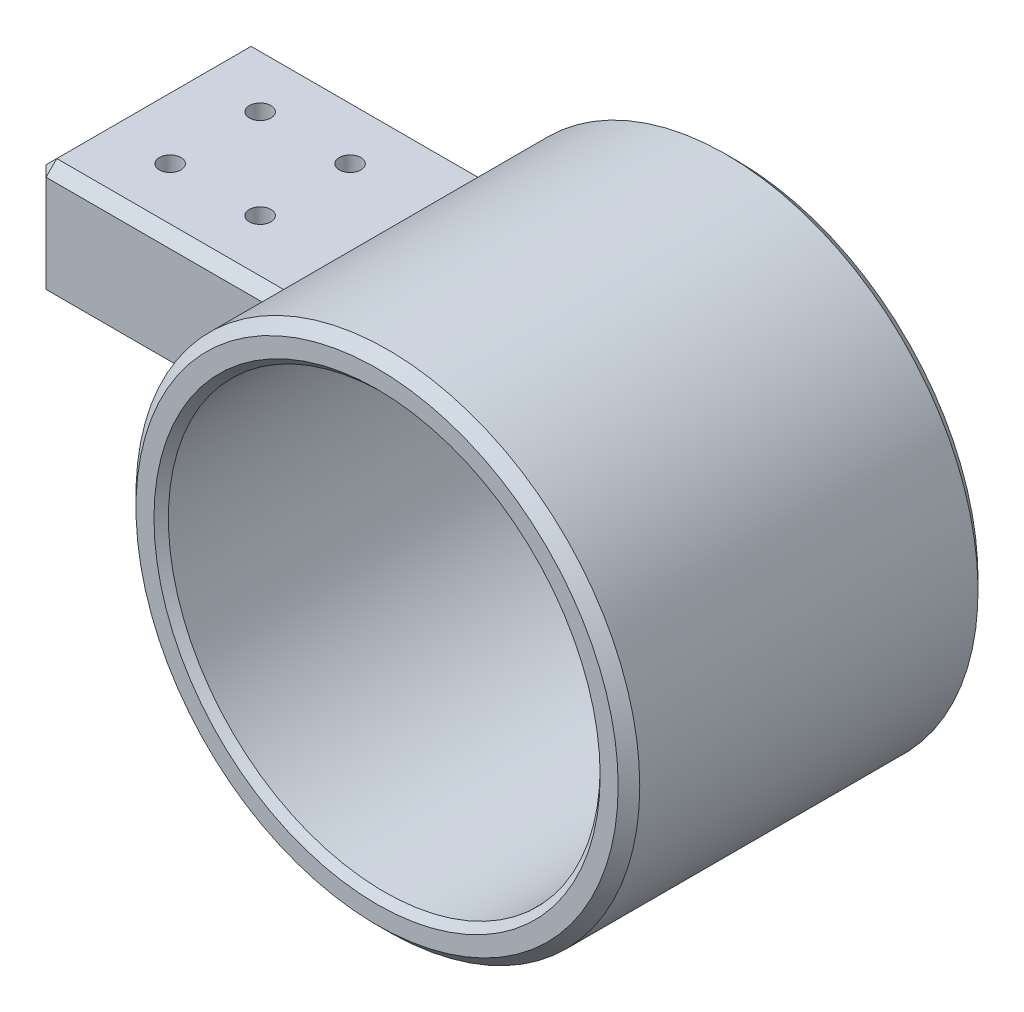
ISO-10303-21;
HEADER;
FILE_DESCRIPTION(('STEP AP214'),'2;1');
FILE_NAME('part.step','',(''),(''),'','','');
FILE_SCHEMA(('AUTOMOTIVE_DESIGN { 1 0 10303 214 1 1 1 1 }'));
ENDSEC;
DATA;
#1=APPLICATION_CONTEXT('core data for automotive mechanical design processes');
#2=APPLICATION_PROTOCOL_DEFINITION('international standard','automotive_design',2000,#1);
#3=PRODUCT_CONTEXT('',#1,'mechanical');
#4=PRODUCT('Part','Part','',(#3));
#5=PRODUCT_RELATED_PRODUCT_CATEGORY('part','',(#4));
#6=PRODUCT_DEFINITION_FORMATION('','',#4);
#7=PRODUCT_DEFINITION_CONTEXT('part definition',#1,'design');
#8=PRODUCT_DEFINITION('design','',#6,#7);
#9=PRODUCT_DEFINITION_SHAPE('','',#8);
#10=(LENGTH_UNIT() NAMED_UNIT(*) SI_UNIT(.MILLI.,.METRE.));
#11=(NAMED_UNIT(*) PLANE_ANGLE_UNIT() SI_UNIT($,.RADIAN.));
#12=(NAMED_UNIT(*) SI_UNIT($,.STERADIAN.) SOLID_ANGLE_UNIT());
#13=UNCERTAINTY_MEASURE_WITH_UNIT(LENGTH_MEASURE(1.E-05),#10,'distance_accuracy_value','');
#14=(GEOMETRIC_REPRESENTATION_CONTEXT(3) GLOBAL_UNCERTAINTY_ASSIGNED_CONTEXT((#13)) GLOBAL_UNIT_ASSIGNED_CONTEXT((#10,
#11,#12)) REPRESENTATION_CONTEXT('',''));
#15=CARTESIAN_POINT('',(0.,0.,0.));
#16=DIRECTION('',(0.,0.,1.));
#17=DIRECTION('',(1.,0.,0.));
#18=AXIS2_PLACEMENT_3D('',#15,#16,#17);
#19=CARTESIAN_POINT('',(0.,0.,50.));
#20=DIRECTION('',(0.,0.,-1.));
#21=DIRECTION('',(-1.,0.,0.));
#22=AXIS2_PLACEMENT_3D('',#19,#20,#21);
#23=CYLINDRICAL_SURFACE('',#22,35.);
#24=CARTESIAN_POINT('',(0.,0.,48.5));
#25=DIRECTION('',(0.,0.,1.));
#26=DIRECTION('',(1.,0.,0.));
#27=AXIS2_PLACEMENT_3D('',#24,#25,#26);
#28=CIRCLE('',#27,35.);
#29=CARTESIAN_POINT('',(35.,0.,48.5));
#30=VERTEX_POINT('',#29);
#31=EDGE_CURVE('E184',#30,#30,#28,.F.);
#32=ORIENTED_EDGE('',*,*,#31,.T.);
#33=EDGE_LOOP('',(#32));
#34=FACE_BOUND('',#33,.T.);
#35=DIRECTION('',(0.,0.,-1.));
#36=VECTOR('',#35,1.);
#37=CARTESIAN_POINT('',(-31.2196559377255,15.8219178082192,50.));
#38=LINE('',#37,#36);
#39=CARTESIAN_POINT('',(-31.2196559377255,15.8219178082192,1.5));
#40=VERTEX_POINT('',#39);
#41=CARTESIAN_POINT('',(-31.2196559377255,15.8219178082192,28.5));
#42=VERTEX_POINT('',#41);
#43=EDGE_CURVE('E181',#40,#42,#38,.F.);
#44=ORIENTED_EDGE('',*,*,#43,.T.);
#45=CARTESIAN_POINT('',(-32.518020467039,12.945205479452,31.5));
#46=CARTESIAN_POINT('',(-32.4705173129702,13.0645316276012,31.3720006531807));
#47=CARTESIAN_POINT('',(-32.4222557667148,13.1838528155139,31.2442801791965));
#48=CARTESIAN_POINT('',(-32.3241816362658,13.4225156631757,30.9894507002295));
#49=CARTESIAN_POINT('',(-32.2743690235219,13.5418573232613,30.8623417065519));
#50=CARTESIAN_POINT('',(-32.1225517348467,13.8999617613975,30.4820092355911));
#51=CARTESIAN_POINT('',(-32.0181714839425,14.1387942531903,30.2297907348745));
#52=CARTESIAN_POINT('',(-31.8564808952528,14.4976502028595,29.8538718835793));
#53=CARTESIAN_POINT('',(-31.8016887549302,14.6174578121394,29.7288766405428));
#54=CARTESIAN_POINT('',(-31.6903462810003,14.8573023564548,29.4799014768715));
#55=CARTESIAN_POINT('',(-31.633796013649,14.9773392826887,29.3559215181972));
#56=CARTESIAN_POINT('',(-31.5188139382657,15.2178235133599,29.1090813902841));
#57=CARTESIAN_POINT('',(-31.4603810609639,15.3382710149878,28.9862219101428));
#58=CARTESIAN_POINT('',(-31.3415348071999,15.5796746361056,28.7419541355256));
#59=CARTESIAN_POINT('',(-31.2811213134111,15.700630785355,28.6205459276027));
#60=CARTESIAN_POINT('',(-31.2196559377255,15.8219178082192,28.5));
#61=B_SPLINE_CURVE_WITH_KNOTS('',3,(#45,#46,#47,#48,#49,#50,#51,#52,#53,#54,#55,#56,#57,#58,#59,
#60),.UNSPECIFIED.,.F.,.F.,(4,2,2,2,2,2,2,4),(0.,0.543972994265221,1.08795600733076,
2.1759664751342,2.72076838902824,3.26554979657465,3.81064627730311,4.35577510666938),.UNSPECIFIED.);
#62=CARTESIAN_POINT('',(-32.518020467039,12.945205479452,31.5));
#63=VERTEX_POINT('',#62);
#64=EDGE_CURVE('E49',#42,#63,#61,.F.);
#65=ORIENTED_EDGE('',*,*,#64,.T.);
#66=CARTESIAN_POINT('',(0.,0.,31.5));
#67=DIRECTION('',(0.,0.,1.));
#68=DIRECTION('',(1.,0.,0.));
#69=AXIS2_PLACEMENT_3D('',#66,#67,#68);
#70=CIRCLE('',#69,35.);
#71=CARTESIAN_POINT('',(-34.9704322470338,-1.43835616438356,31.5));
#72=VERTEX_POINT('',#71);
#73=EDGE_CURVE('E140',#63,#72,#70,.T.);
#74=ORIENTED_EDGE('',*,*,#73,.T.);
#75=DIRECTION('',(0.,0.,-1.));
#76=VECTOR('',#75,1.);
#77=CARTESIAN_POINT('',(-34.9704322470338,-1.43835616438355,50.));
#78=LINE('',#77,#76);
#79=CARTESIAN_POINT('',(-34.9704322470338,-1.43835616438356,1.5));
#80=VERTEX_POINT('',#79);
#81=EDGE_CURVE('E133',#72,#80,#78,.T.);
#82=ORIENTED_EDGE('',*,*,#81,.T.);
#83=CARTESIAN_POINT('',(0.,0.,1.5));
#84=DIRECTION('',(0.,0.,1.));
#85=DIRECTION('',(1.,0.,0.));
#86=AXIS2_PLACEMENT_3D('',#83,#84,#85);
#87=CIRCLE('',#86,35.);
#88=EDGE_CURVE('E137',#80,#40,#87,.T.);
#89=ORIENTED_EDGE('',*,*,#88,.T.);
#90=EDGE_LOOP('',(#44,#65,#74,#82,#89));
#91=FACE_BOUND('',#90,.T.);
#92=ADVANCED_FACE('F39',(#34,#91),#23,.T.);
#93=CARTESIAN_POINT('',(0.,0.,50.));
#94=DIRECTION('',(0.,0.,1.));
#95=DIRECTION('',(1.,0.,0.));
#96=AXIS2_PLACEMENT_3D('',#93,#94,#95);
#97=PLANE('',#96);
#98=CARTESIAN_POINT('',(0.,0.,50.));
#99=DIRECTION('',(0.,0.,1.));
#100=DIRECTION('',(1.,0.,0.));
#101=AXIS2_PLACEMENT_3D('',#98,#99,#100);
#102=CIRCLE('',#101,33.5);
#103=CARTESIAN_POINT('',(33.5,0.,50.));
#104=VERTEX_POINT('',#103);
#105=EDGE_CURVE('E171',#104,#104,#102,.T.);
#106=ORIENTED_EDGE('',*,*,#105,.T.);
#107=EDGE_LOOP('',(#106));
#108=FACE_BOUND('',#107,.T.);
#109=CARTESIAN_POINT('',(0.,0.,50.));
#110=DIRECTION('',(0.,0.,1.));
#111=DIRECTION('',(1.,0.,0.));
#112=AXIS2_PLACEMENT_3D('',#109,#110,#111);
#113=CIRCLE('',#112,31.);
#114=CARTESIAN_POINT('',(31.,0.,50.));
#115=VERTEX_POINT('',#114);
#116=EDGE_CURVE('E287',#115,#115,#113,.F.);
#117=ORIENTED_EDGE('',*,*,#116,.T.);
#118=EDGE_LOOP('',(#117));
#119=FACE_BOUND('',#118,.T.);
#120=ADVANCED_FACE('F262',(#108,#119),#97,.T.);
#121=CARTESIAN_POINT('',(0.,0.,0.));
#122=DIRECTION('',(0.,0.,1.));
#123=DIRECTION('',(1.,0.,0.));
#124=AXIS2_PLACEMENT_3D('',#121,#122,#123);
#125=PLANE('',#124);
#126=DIRECTION('',(0.721490086699384,-0.692424764717811,0.));
#127=VECTOR('',#126,1.);
#128=CARTESIAN_POINT('',(-33.4716994364466,-1.37671232876712,0.));
#129=LINE('',#128,#127);
#130=CARTESIAN_POINT('',(-36.469165057621,1.5,0.));
#131=VERTEX_POINT('',#130);
#132=CARTESIAN_POINT('',(-33.4716994364466,-1.37671232876712,0.));
#133=VERTEX_POINT('',#132);
#134=EDGE_CURVE('E159',#131,#133,#129,.T.);
#135=ORIENTED_EDGE('',*,*,#134,.F.);
#136=DIRECTION('',(-1.,0.,0.));
#137=VECTOR('',#136,1.);
#138=CARTESIAN_POINT('',(0.,1.5,0.));
#139=LINE('',#138,#137);
#140=CARTESIAN_POINT('',(-66.,1.5,0.));
#141=VERTEX_POINT('',#140);
#142=EDGE_CURVE('E224',#131,#141,#139,.T.);
#143=ORIENTED_EDGE('',*,*,#142,.T.);
#144=DIRECTION('',(0.,1.,0.));
#145=VECTOR('',#144,1.);
#146=CARTESIAN_POINT('',(-66.,0.,0.));
#147=LINE('',#146,#145);
#148=CARTESIAN_POINT('',(-66.,13.5,0.));
#149=VERTEX_POINT('',#148);
#150=EDGE_CURVE('E221',#141,#149,#147,.T.);
#151=ORIENTED_EDGE('',*,*,#150,.T.);
#152=DIRECTION('',(1.,0.,0.));
#153=VECTOR('',#152,1.);
#154=CARTESIAN_POINT('',(-31.6227766016838,13.5,0.));
#155=LINE('',#154,#153);
#156=CARTESIAN_POINT('',(-32.5576411921994,13.5,0.));
#157=VERTEX_POINT('',#156);
#158=EDGE_CURVE('E218',#149,#157,#155,.T.);
#159=ORIENTED_EDGE('',*,*,#158,.T.);
#160=DIRECTION('',(-0.852072413155291,-0.523423922590208,0.));
#161=VECTOR('',#160,1.);
#162=CARTESIAN_POINT('',(-32.5576411921994,13.5,0.));
#163=LINE('',#162,#161);
#164=CARTESIAN_POINT('',(-29.8816706832515,15.1438356164383,0.));
#165=VERTEX_POINT('',#164);
#166=EDGE_CURVE('E214',#165,#157,#163,.T.);
#167=ORIENTED_EDGE('',*,*,#166,.F.);
#168=CARTESIAN_POINT('',(0.,0.,0.));
#169=DIRECTION('',(0.,0.,1.));
#170=DIRECTION('',(1.,0.,0.));
#171=AXIS2_PLACEMENT_3D('',#168,#169,#170);
#172=CIRCLE('',#171,33.5);
#173=EDGE_CURVE('E211',#165,#133,#172,.F.);
#174=ORIENTED_EDGE('',*,*,#173,.T.);
#175=EDGE_LOOP('',(#135,#143,#151,#159,#167,#174));
#176=FACE_BOUND('',#175,.T.);
#177=CARTESIAN_POINT('',(0.,0.,0.));
#178=DIRECTION('',(0.,0.,1.));
#179=DIRECTION('',(1.,0.,0.));
#180=AXIS2_PLACEMENT_3D('',#177,#178,#179);
#181=CIRCLE('',#180,31.);
#182=CARTESIAN_POINT('',(31.,0.,0.));
#183=VERTEX_POINT('',#182);
#184=EDGE_CURVE('E175',#183,#183,#181,.T.);
#185=ORIENTED_EDGE('',*,*,#184,.T.);
#186=EDGE_LOOP('',(#185));
#187=FACE_BOUND('',#186,.T.);
#188=ADVANCED_FACE('F264',(#176,#187),#125,.F.);
#189=CARTESIAN_POINT('',(0.,0.,50.));
#190=DIRECTION('',(0.,0.,-1.));
#191=DIRECTION('',(-1.,0.,0.));
#192=AXIS2_PLACEMENT_3D('',#189,#190,#191);
#193=CYLINDRICAL_SURFACE('',#192,30.);
#194=CARTESIAN_POINT('',(0.,0.,49.));
#195=DIRECTION('',(0.,0.,1.));
#196=DIRECTION('',(1.,0.,0.));
#197=AXIS2_PLACEMENT_3D('',#194,#195,#196);
#198=CIRCLE('',#197,30.);
#199=CARTESIAN_POINT('',(30.,0.,49.));
#200=VERTEX_POINT('',#199);
#201=EDGE_CURVE('E286',#200,#200,#198,.T.);
#202=ORIENTED_EDGE('',*,*,#201,.T.);
#203=EDGE_LOOP('',(#202));
#204=FACE_BOUND('',#203,.T.);
#205=CARTESIAN_POINT('',(0.,0.,0.999999999999973));
#206=DIRECTION('',(0.,0.,1.));
#207=DIRECTION('',(1.,0.,0.));
#208=AXIS2_PLACEMENT_3D('',#205,#206,#207);
#209=CIRCLE('',#208,30.);
#210=CARTESIAN_POINT('',(30.,0.,0.999999999999973));
#211=VERTEX_POINT('',#210);
#212=EDGE_CURVE('E283',#211,#211,#209,.F.);
#213=ORIENTED_EDGE('',*,*,#212,.T.);
#214=EDGE_LOOP('',(#213));
#215=FACE_BOUND('',#214,.T.);
#216=ADVANCED_FACE('F300',(#204,#215),#193,.F.);
#217=CARTESIAN_POINT('',(35.001,0.,30.));
#218=DIRECTION('',(0.,0.,1.));
#219=DIRECTION('',(1.,0.,0.));
#220=AXIS2_PLACEMENT_3D('',#217,#218,#219);
#221=PLANE('',#220);
#222=DIRECTION('',(-1.,0.,0.));
#223=VECTOR('',#222,1.);
#224=CARTESIAN_POINT('',(35.001,13.5,30.));
#225=LINE('',#224,#223);
#226=CARTESIAN_POINT('',(-33.9116499156264,13.5,30.));
#227=VERTEX_POINT('',#226);
#228=CARTESIAN_POINT('',(-66.,13.5,30.));
#229=VERTEX_POINT('',#228);
#230=EDGE_CURVE('E64',#227,#229,#225,.T.);
#231=ORIENTED_EDGE('',*,*,#230,.T.);
#232=DIRECTION('',(0.,-1.,0.));
#233=VECTOR('',#232,1.);
#234=CARTESIAN_POINT('',(-66.,0.,30.));
#235=LINE('',#234,#233);
#236=CARTESIAN_POINT('',(-66.,0.,30.));
#237=VERTEX_POINT('',#236);
#238=EDGE_CURVE('E242',#229,#237,#235,.T.);
#239=ORIENTED_EDGE('',*,*,#238,.T.);
#240=DIRECTION('',(1.,0.,0.));
#241=VECTOR('',#240,1.);
#242=CARTESIAN_POINT('',(-67.5,0.,30.));
#243=LINE('',#242,#241);
#244=CARTESIAN_POINT('',(-36.5,0.,30.));
#245=VERTEX_POINT('',#244);
#246=EDGE_CURVE('E294',#237,#245,#243,.T.);
#247=ORIENTED_EDGE('',*,*,#246,.T.);
#248=CARTESIAN_POINT('',(0.,0.,30.));
#249=DIRECTION('',(0.,0.,1.));
#250=DIRECTION('',(1.,0.,0.));
#251=AXIS2_PLACEMENT_3D('',#248,#249,#250);
#252=CIRCLE('',#251,36.5);
#253=EDGE_CURVE('E237',#245,#227,#252,.F.);
#254=ORIENTED_EDGE('',*,*,#253,.T.);
#255=EDGE_LOOP('',(#231,#239,#247,#254));
#256=FACE_BOUND('',#255,.T.);
#257=ADVANCED_FACE('F306',(#256),#221,.T.);
#258=CARTESIAN_POINT('',(35.001,15.,30.));
#259=DIRECTION('',(0.,1.,0.));
#260=DIRECTION('',(0.,0.,1.));
#261=AXIS2_PLACEMENT_3D('',#258,#259,#260);
#262=PLANE('',#261);
#263=DIRECTION('',(0.,0.,1.));
#264=VECTOR('',#263,1.);
#265=CARTESIAN_POINT('',(-66.,15.,30.));
#266=LINE('',#265,#264);
#267=CARTESIAN_POINT('',(-66.,15.,1.5));
#268=VERTEX_POINT('',#267);
#269=CARTESIAN_POINT('',(-66.,15.,28.5));
#270=VERTEX_POINT('',#269);
#271=EDGE_CURVE('E191',#268,#270,#266,.T.);
#272=ORIENTED_EDGE('',*,*,#271,.T.);
#273=DIRECTION('',(1.,0.,0.));
#274=VECTOR('',#273,1.);
#275=CARTESIAN_POINT('',(35.001,15.,28.5));
#276=LINE('',#275,#274);
#277=CARTESIAN_POINT('',(-32.5576411921994,15.,28.5));
#278=VERTEX_POINT('',#277);
#279=EDGE_CURVE('E198',#270,#278,#276,.T.);
#280=ORIENTED_EDGE('',*,*,#279,.T.);
#281=DIRECTION('',(0.,0.,-1.));
#282=VECTOR('',#281,1.);
#283=CARTESIAN_POINT('',(-32.5576411921994,15.,30.));
#284=LINE('',#283,#282);
#285=CARTESIAN_POINT('',(-32.5576411921994,15.,1.5));
#286=VERTEX_POINT('',#285);
#287=EDGE_CURVE('E194',#278,#286,#284,.T.);
#288=ORIENTED_EDGE('',*,*,#287,.T.);
#289=DIRECTION('',(-1.,0.,0.));
#290=VECTOR('',#289,1.);
#291=CARTESIAN_POINT('',(-67.5,15.,1.5));
#292=LINE('',#291,#290);
#293=EDGE_CURVE('E188',#286,#268,#292,.T.);
#294=ORIENTED_EDGE('',*,*,#293,.T.);
#295=EDGE_LOOP('',(#272,#280,#288,#294));
#296=FACE_BOUND('',#295,.T.);
#297=CARTESIAN_POINT('',(-57.5,15.,21.25));
#298=DIRECTION('',(0.,1.,0.));
#299=DIRECTION('',(0.,0.,1.));
#300=AXIS2_PLACEMENT_3D('',#297,#298,#299);
#301=CIRCLE('',#300,1.5);
#302=CARTESIAN_POINT('',(-57.5,15.,22.75));
#303=VERTEX_POINT('',#302);
#304=EDGE_CURVE('E368',#303,#303,#301,.T.);
#305=ORIENTED_EDGE('',*,*,#304,.F.);
#306=EDGE_LOOP('',(#305));
#307=FACE_BOUND('',#306,.T.);
#308=CARTESIAN_POINT('',(-45.,15.,21.25));
#309=DIRECTION('',(0.,1.,0.));
#310=DIRECTION('',(0.,0.,1.));
#311=AXIS2_PLACEMENT_3D('',#308,#309,#310);
#312=CIRCLE('',#311,1.5);
#313=CARTESIAN_POINT('',(-45.,15.,22.75));
#314=VERTEX_POINT('',#313);
#315=EDGE_CURVE('E364',#314,#314,#312,.T.);
#316=ORIENTED_EDGE('',*,*,#315,.F.);
#317=EDGE_LOOP('',(#316));
#318=FACE_BOUND('',#317,.T.);
#319=CARTESIAN_POINT('',(-45.,15.,8.75));
#320=DIRECTION('',(0.,1.,0.));
#321=DIRECTION('',(0.,0.,1.));
#322=AXIS2_PLACEMENT_3D('',#319,#320,#321);
#323=CIRCLE('',#322,1.5);
#324=CARTESIAN_POINT('',(-45.,15.,10.25));
#325=VERTEX_POINT('',#324);
#326=EDGE_CURVE('E360',#325,#325,#323,.T.);
#327=ORIENTED_EDGE('',*,*,#326,.F.);
#328=EDGE_LOOP('',(#327));
#329=FACE_BOUND('',#328,.T.);
#330=CARTESIAN_POINT('',(-57.5,15.,8.74999999999999));
#331=DIRECTION('',(0.,1.,0.));
#332=DIRECTION('',(0.,0.,1.));
#333=AXIS2_PLACEMENT_3D('',#330,#331,#332);
#334=CIRCLE('',#333,1.5);
#335=CARTESIAN_POINT('',(-57.5,15.,10.25));
#336=VERTEX_POINT('',#335);
#337=EDGE_CURVE('E356',#336,#336,#334,.T.);
#338=ORIENTED_EDGE('',*,*,#337,.F.);
#339=EDGE_LOOP('',(#338));
#340=FACE_BOUND('',#339,.T.);
#341=ADVANCED_FACE('F466',(#296,#307,#318,#329,#340),#262,.T.);
#342=CARTESIAN_POINT('',(-67.5,0.,30.));
#343=DIRECTION('',(0.,1.,0.));
#344=DIRECTION('',(0.,0.,1.));
#345=AXIS2_PLACEMENT_3D('',#342,#343,#344);
#346=PLANE('',#345);
#347=CARTESIAN_POINT('',(-57.5,0.,21.25));
#348=DIRECTION('',(0.,-1.,0.));
#349=DIRECTION('',(0.,0.,-1.));
#350=AXIS2_PLACEMENT_3D('',#347,#348,#349);
#351=CIRCLE('',#350,1.5);
#352=CARTESIAN_POINT('',(-57.5,0.,19.75));
#353=VERTEX_POINT('',#352);
#354=EDGE_CURVE('E339',#353,#353,#351,.T.);
#355=ORIENTED_EDGE('',*,*,#354,.F.);
#356=EDGE_LOOP('',(#355));
#357=FACE_BOUND('',#356,.T.);
#358=CARTESIAN_POINT('',(-45.,0.,21.25));
#359=DIRECTION('',(0.,-1.,0.));
#360=DIRECTION('',(0.,0.,-1.));
#361=AXIS2_PLACEMENT_3D('',#358,#359,#360);
#362=CIRCLE('',#361,1.5);
#363=CARTESIAN_POINT('',(-45.,0.,19.75));
#364=VERTEX_POINT('',#363);
#365=EDGE_CURVE('E342',#364,#364,#362,.T.);
#366=ORIENTED_EDGE('',*,*,#365,.F.);
#367=EDGE_LOOP('',(#366));
#368=FACE_BOUND('',#367,.T.);
#369=CARTESIAN_POINT('',(-45.,0.,8.75));
#370=DIRECTION('',(0.,-1.,0.));
#371=DIRECTION('',(0.,0.,-1.));
#372=AXIS2_PLACEMENT_3D('',#369,#370,#371);
#373=CIRCLE('',#372,1.5);
#374=CARTESIAN_POINT('',(-45.,0.,7.25));
#375=VERTEX_POINT('',#374);
#376=EDGE_CURVE('E348',#375,#375,#373,.T.);
#377=ORIENTED_EDGE('',*,*,#376,.F.);
#378=EDGE_LOOP('',(#377));
#379=FACE_BOUND('',#378,.T.);
#380=CARTESIAN_POINT('',(-57.5,0.,8.75));
#381=DIRECTION('',(0.,-1.,0.));
#382=DIRECTION('',(0.,0.,-1.));
#383=AXIS2_PLACEMENT_3D('',#380,#381,#382);
#384=CIRCLE('',#383,1.5);
#385=CARTESIAN_POINT('',(-57.5,0.,7.24999999999999));
#386=VERTEX_POINT('',#385);
#387=EDGE_CURVE('E352',#386,#386,#384,.T.);
#388=ORIENTED_EDGE('',*,*,#387,.F.);
#389=EDGE_LOOP('',(#388));
#390=FACE_BOUND('',#389,.T.);
#391=ORIENTED_EDGE('',*,*,#246,.F.);
#392=DIRECTION('',(-0.707106781186548,0.,-0.707106781186548));
#393=VECTOR('',#392,1.);
#394=CARTESIAN_POINT('',(-67.5,0.,28.5));
#395=LINE('',#394,#393);
#396=CARTESIAN_POINT('',(-67.5,0.,28.5));
#397=VERTEX_POINT('',#396);
#398=EDGE_CURVE('E206',#237,#397,#395,.T.);
#399=ORIENTED_EDGE('',*,*,#398,.T.);
#400=DIRECTION('',(0.,0.,1.));
#401=VECTOR('',#400,1.);
#402=CARTESIAN_POINT('',(-67.5,0.,30.));
#403=LINE('',#402,#401);
#404=CARTESIAN_POINT('',(-67.5,0.,1.5));
#405=VERTEX_POINT('',#404);
#406=EDGE_CURVE('E372',#405,#397,#403,.T.);
#407=ORIENTED_EDGE('',*,*,#406,.F.);
#408=DIRECTION('',(1.,0.,0.));
#409=VECTOR('',#408,1.);
#410=CARTESIAN_POINT('',(-67.5,0.,1.50000000000002));
#411=LINE('',#410,#409);
#412=CARTESIAN_POINT('',(-36.469165057621,0.,1.50000000000002));
#413=VERTEX_POINT('',#412);
#414=EDGE_CURVE('E203',#405,#413,#411,.T.);
#415=ORIENTED_EDGE('',*,*,#414,.T.);
#416=DIRECTION('',(0.,0.,1.));
#417=VECTOR('',#416,1.);
#418=CARTESIAN_POINT('',(-36.469165057621,0.,30.));
#419=LINE('',#418,#417);
#420=CARTESIAN_POINT('',(-36.469165057621,0.,30.0308349423791));
#421=VERTEX_POINT('',#420);
#422=EDGE_CURVE('E56',#413,#421,#419,.T.);
#423=ORIENTED_EDGE('',*,*,#422,.T.);
#424=DIRECTION('',(0.707106781186551,0.,0.707106781186544));
#425=VECTOR('',#424,1.);
#426=CARTESIAN_POINT('',(0.,0.,66.4999999999997));
#427=LINE('',#426,#425);
#428=EDGE_CURVE('E11',#421,#245,#427,.F.);
#429=ORIENTED_EDGE('',*,*,#428,.T.);
#430=EDGE_LOOP('',(#391,#399,#407,#415,#423,#429));
#431=FACE_BOUND('',#430,.T.);
#432=ADVANCED_FACE('F481',(#357,#368,#379,#390,#431),#346,.F.);
#433=CARTESIAN_POINT('',(-67.5,0.,0.));
#434=DIRECTION('',(1.,0.,0.));
#435=DIRECTION('',(0.,0.,-1.));
#436=AXIS2_PLACEMENT_3D('',#433,#434,#435);
#437=PLANE('',#436);
#438=ORIENTED_EDGE('',*,*,#406,.T.);
#439=DIRECTION('',(0.,1.,0.));
#440=VECTOR('',#439,1.);
#441=CARTESIAN_POINT('',(-67.5,15.,28.5));
#442=LINE('',#441,#440);
#443=CARTESIAN_POINT('',(-67.5,13.5,28.5));
#444=VERTEX_POINT('',#443);
#445=EDGE_CURVE('E234',#397,#444,#442,.T.);
#446=ORIENTED_EDGE('',*,*,#445,.T.);
#447=DIRECTION('',(0.,0.,-1.));
#448=VECTOR('',#447,1.);
#449=CARTESIAN_POINT('',(-67.5,13.5,0.));
#450=LINE('',#449,#448);
#451=CARTESIAN_POINT('',(-67.5,13.5,1.5));
#452=VERTEX_POINT('',#451);
#453=EDGE_CURVE('E231',#444,#452,#450,.T.);
#454=ORIENTED_EDGE('',*,*,#453,.T.);
#455=DIRECTION('',(0.,-1.,0.));
#456=VECTOR('',#455,1.);
#457=CARTESIAN_POINT('',(-67.5,0.,1.5));
#458=LINE('',#457,#456);
#459=EDGE_CURVE('E228',#452,#405,#458,.T.);
#460=ORIENTED_EDGE('',*,*,#459,.T.);
#461=EDGE_LOOP('',(#438,#446,#454,#460));
#462=FACE_BOUND('',#461,.T.);
#463=ADVANCED_FACE('F479',(#462),#437,.F.);
#464=CARTESIAN_POINT('',(-57.5,35.,8.74999999999999));
#465=DIRECTION('',(0.,-1.,0.));
#466=DIRECTION('',(0.,0.,-1.));
#467=AXIS2_PLACEMENT_3D('',#464,#465,#466);
#468=CYLINDRICAL_SURFACE('',#467,1.5);
#469=ORIENTED_EDGE('',*,*,#337,.T.);
#470=EDGE_LOOP('',(#469));
#471=FACE_BOUND('',#470,.T.);
#472=ORIENTED_EDGE('',*,*,#387,.T.);
#473=EDGE_LOOP('',(#472));
#474=FACE_BOUND('',#473,.T.);
#475=ADVANCED_FACE('F513',(#471,#474),#468,.F.);
#476=CARTESIAN_POINT('',(-45.,35.,8.75));
#477=DIRECTION('',(0.,-1.,0.));
#478=DIRECTION('',(0.,0.,-1.));
#479=AXIS2_PLACEMENT_3D('',#476,#477,#478);
#480=CYLINDRICAL_SURFACE('',#479,1.5);
#481=ORIENTED_EDGE('',*,*,#326,.T.);
#482=EDGE_LOOP('',(#481));
#483=FACE_BOUND('',#482,.T.);
#484=ORIENTED_EDGE('',*,*,#376,.T.);
#485=EDGE_LOOP('',(#484));
#486=FACE_BOUND('',#485,.T.);
#487=ADVANCED_FACE('F594',(#483,#486),#480,.F.);
#488=CARTESIAN_POINT('',(-45.,35.,21.25));
#489=DIRECTION('',(0.,-1.,0.));
#490=DIRECTION('',(0.,0.,-1.));
#491=AXIS2_PLACEMENT_3D('',#488,#489,#490);
#492=CYLINDRICAL_SURFACE('',#491,1.5);
#493=ORIENTED_EDGE('',*,*,#315,.T.);
#494=EDGE_LOOP('',(#493));
#495=FACE_BOUND('',#494,.T.);
#496=ORIENTED_EDGE('',*,*,#365,.T.);
#497=EDGE_LOOP('',(#496));
#498=FACE_BOUND('',#497,.T.);
#499=ADVANCED_FACE('F584',(#495,#498),#492,.F.);
#500=CARTESIAN_POINT('',(-57.5,35.,21.25));
#501=DIRECTION('',(0.,-1.,0.));
#502=DIRECTION('',(0.,0.,-1.));
#503=AXIS2_PLACEMENT_3D('',#500,#501,#502);
#504=CYLINDRICAL_SURFACE('',#503,1.5);
#505=ORIENTED_EDGE('',*,*,#304,.T.);
#506=EDGE_LOOP('',(#505));
#507=FACE_BOUND('',#506,.T.);
#508=ORIENTED_EDGE('',*,*,#354,.T.);
#509=EDGE_LOOP('',(#508));
#510=FACE_BOUND('',#509,.T.);
#511=ADVANCED_FACE('F269',(#507,#510),#504,.F.);
#512=CARTESIAN_POINT('',(0.,0.,50.));
#513=DIRECTION('',(0.,0.,1.));
#514=DIRECTION('',(1.,0.,0.));
#515=AXIS2_PLACEMENT_3D('',#512,#513,#514);
#516=CONICAL_SURFACE('',#515,31.,0.785398163397443);
#517=ORIENTED_EDGE('',*,*,#201,.F.);
#518=EDGE_LOOP('',(#517));
#519=FACE_BOUND('',#518,.T.);
#520=ORIENTED_EDGE('',*,*,#116,.F.);
#521=EDGE_LOOP('',(#520));
#522=FACE_BOUND('',#521,.T.);
#523=ADVANCED_FACE('F266',(#519,#522),#516,.F.);
#524=CARTESIAN_POINT('',(0.,0.,0.999999999999973));
#525=DIRECTION('',(0.,0.,-1.));
#526=DIRECTION('',(-1.,0.,0.));
#527=AXIS2_PLACEMENT_3D('',#524,#525,#526);
#528=CONICAL_SURFACE('',#527,30.,0.785398163397457);
#529=ORIENTED_EDGE('',*,*,#184,.F.);
#530=EDGE_LOOP('',(#529));
#531=FACE_BOUND('',#530,.T.);
#532=ORIENTED_EDGE('',*,*,#212,.F.);
#533=EDGE_LOOP('',(#532));
#534=FACE_BOUND('',#533,.T.);
#535=ADVANCED_FACE('F268',(#531,#534),#528,.F.);
#536=CARTESIAN_POINT('',(0.,0.,50.));
#537=DIRECTION('',(0.,0.,-1.));
#538=DIRECTION('',(-1.,0.,0.));
#539=AXIS2_PLACEMENT_3D('',#536,#537,#538);
#540=CONICAL_SURFACE('',#539,33.5,0.785398163397444);
#541=ORIENTED_EDGE('',*,*,#31,.F.);
#542=EDGE_LOOP('',(#541));
#543=FACE_BOUND('',#542,.T.);
#544=ORIENTED_EDGE('',*,*,#105,.F.);
#545=EDGE_LOOP('',(#544));
#546=FACE_BOUND('',#545,.T.);
#547=ADVANCED_FACE('F272',(#543,#546),#540,.T.);
#548=CARTESIAN_POINT('',(-67.5,0.,28.5));
#549=DIRECTION('',(-0.707106781186547,0.,0.707106781186547));
#550=DIRECTION('',(0.,-1.,0.));
#551=AXIS2_PLACEMENT_3D('',#548,#549,#550);
#552=PLANE('',#551);
#553=ORIENTED_EDGE('',*,*,#398,.F.);
#554=ORIENTED_EDGE('',*,*,#238,.F.);
#555=DIRECTION('',(0.707106781186547,0.,0.707106781186547));
#556=VECTOR('',#555,1.);
#557=CARTESIAN_POINT('',(-66.75,13.5,29.25));
#558=LINE('',#557,#556);
#559=EDGE_CURVE('E331',#444,#229,#558,.T.);
#560=ORIENTED_EDGE('',*,*,#559,.F.);
#561=ORIENTED_EDGE('',*,*,#445,.F.);
#562=EDGE_LOOP('',(#553,#554,#560,#561));
#563=FACE_BOUND('',#562,.T.);
#564=ADVANCED_FACE('F41',(#563),#552,.T.);
#565=CARTESIAN_POINT('',(-67.5,13.5,0.));
#566=DIRECTION('',(-0.707106781186547,0.707106781186547,0.));
#567=DIRECTION('',(0.,0.,1.));
#568=AXIS2_PLACEMENT_3D('',#565,#566,#567);
#569=PLANE('',#568);
#570=DIRECTION('',(0.707106781186547,0.707106781186547,0.));
#571=VECTOR('',#570,1.);
#572=CARTESIAN_POINT('',(-67.5,13.5,1.5));
#573=LINE('',#572,#571);
#574=EDGE_CURVE('E321',#452,#268,#573,.T.);
#575=ORIENTED_EDGE('',*,*,#574,.F.);
#576=ORIENTED_EDGE('',*,*,#453,.F.);
#577=DIRECTION('',(-0.707106781186548,-0.707106781186548,0.));
#578=VECTOR('',#577,1.);
#579=CARTESIAN_POINT('',(-66.,15.,28.5));
#580=LINE('',#579,#578);
#581=EDGE_CURVE('E328',#270,#444,#580,.T.);
#582=ORIENTED_EDGE('',*,*,#581,.F.);
#583=ORIENTED_EDGE('',*,*,#271,.F.);
#584=EDGE_LOOP('',(#575,#576,#582,#583));
#585=FACE_BOUND('',#584,.T.);
#586=ADVANCED_FACE('F463',(#585),#569,.T.);
#587=CARTESIAN_POINT('',(-67.5,0.,1.5));
#588=DIRECTION('',(0.707106781186544,0.,0.707106781186551));
#589=DIRECTION('',(0.,-1.,0.));
#590=AXIS2_PLACEMENT_3D('',#587,#588,#589);
#591=PLANE('',#590);
#592=DIRECTION('',(0.707106781186551,0.,-0.707106781186544));
#593=VECTOR('',#592,1.);
#594=CARTESIAN_POINT('',(-67.5,13.5,1.5));
#595=LINE('',#594,#593);
#596=EDGE_CURVE('E317',#149,#452,#595,.F.);
#597=ORIENTED_EDGE('',*,*,#596,.F.);
#598=ORIENTED_EDGE('',*,*,#150,.F.);
#599=DIRECTION('',(-0.577350269189631,-0.57735026918962,0.577350269189626));
#600=VECTOR('',#599,1.);
#601=CARTESIAN_POINT('',(-67.5,0.,1.5));
#602=LINE('',#601,#600);
#603=EDGE_CURVE('E43',#405,#141,#602,.F.);
#604=ORIENTED_EDGE('',*,*,#603,.F.);
#605=ORIENTED_EDGE('',*,*,#459,.F.);
#606=EDGE_LOOP('',(#597,#598,#604,#605));
#607=FACE_BOUND('',#606,.T.);
#608=ADVANCED_FACE('F476',(#607),#591,.F.);
#609=CARTESIAN_POINT('',(-67.5,0.,1.50000000000002));
#610=DIRECTION('',(0.,0.707106781186551,0.707106781186544));
#611=DIRECTION('',(1.,0.,0.));
#612=AXIS2_PLACEMENT_3D('',#609,#610,#611);
#613=PLANE('',#612);
#614=ORIENTED_EDGE('',*,*,#603,.T.);
#615=ORIENTED_EDGE('',*,*,#142,.F.);
#616=DIRECTION('',(0.,0.707106781186544,-0.707106781186551));
#617=VECTOR('',#616,1.);
#618=CARTESIAN_POINT('',(-36.469165057621,0.,1.50000000000002));
#619=LINE('',#618,#617);
#620=EDGE_CURVE('E152',#413,#131,#619,.T.);
#621=ORIENTED_EDGE('',*,*,#620,.F.);
#622=ORIENTED_EDGE('',*,*,#414,.F.);
#623=EDGE_LOOP('',(#614,#615,#621,#622));
#624=FACE_BOUND('',#623,.T.);
#625=ADVANCED_FACE('F312',(#624),#613,.F.);
#626=CARTESIAN_POINT('',(-36.469165057621,0.,50.));
#627=DIRECTION('',(-0.692424764717811,-0.721490086699384,0.));
#628=DIRECTION('',(0.,0.,-1.));
#629=AXIS2_PLACEMENT_3D('',#626,#627,#628);
#630=PLANE('',#629);
#631=CARTESIAN_POINT('',(-34.9704322470338,-1.43835616438356,31.5));
#632=CARTESIAN_POINT('',(-35.096203299304,-1.31765181531218,31.3792951852957));
#633=CARTESIAN_POINT('',(-35.2217456049854,-1.19716699774353,31.2581329054924));
#634=CARTESIAN_POINT('',(-35.4723848392769,-0.956624797604228,31.0149351776933));
#635=CARTESIAN_POINT('',(-35.5974817782609,-0.836567405077673,30.8928997502374));
#636=CARTESIAN_POINT('',(-35.847248111254,-0.596862941294404,30.6479920021526));
#637=CARTESIAN_POINT('',(-35.9719175058811,-0.477215869444736,30.5251196827339));
#638=CARTESIAN_POINT('',(-36.2208461047521,-0.238315391555497,30.2785708359361));
#639=CARTESIAN_POINT('',(-36.3451052993099,-0.119061994811972,30.1548942897684));
#640=CARTESIAN_POINT('',(-36.469165057621,0.,30.0308349423791));
#641=B_SPLINE_CURVE_WITH_KNOTS('',3,(#631,#632,#633,#634,#635,#636,#637,#638,#639,#640),
.UNSPECIFIED.,.F.,.F.,(4,2,2,2,4),(0.,0.636094794521418,1.27217467442864,1.90825363474946,
2.54434750919141),.UNSPECIFIED.);
#642=EDGE_CURVE('E153',#421,#72,#641,.F.);
#643=ORIENTED_EDGE('',*,*,#642,.F.);
#644=ORIENTED_EDGE('',*,*,#422,.F.);
#645=DIRECTION('',(0.721490086699384,-0.692424764717811,0.));
#646=VECTOR('',#645,1.);
#647=CARTESIAN_POINT('',(-34.9704322470338,-1.43835616438356,1.5));
#648=LINE('',#647,#646);
#649=EDGE_CURVE('E145',#80,#413,#648,.F.);
#650=ORIENTED_EDGE('',*,*,#649,.F.);
#651=ORIENTED_EDGE('',*,*,#81,.F.);
#652=EDGE_LOOP('',(#643,#644,#650,#651));
#653=FACE_BOUND('',#652,.T.);
#654=ADVANCED_FACE('F147',(#653),#630,.T.);
#655=CARTESIAN_POINT('',(-66.,15.,28.5));
#656=DIRECTION('',(-0.577350269189624,0.577350269189629,0.577350269189624));
#657=DIRECTION('',(0.,-0.707106781186544,0.707106781186551));
#658=AXIS2_PLACEMENT_3D('',#655,#656,#657);
#659=PLANE('',#658);
#660=ORIENTED_EDGE('',*,*,#581,.T.);
#661=ORIENTED_EDGE('',*,*,#559,.T.);
#662=DIRECTION('',(0.,-0.707106781186544,0.707106781186551));
#663=VECTOR('',#662,1.);
#664=CARTESIAN_POINT('',(-66.,15.,28.5));
#665=LINE('',#664,#663);
#666=EDGE_CURVE('E447',#270,#229,#665,.T.);
#667=ORIENTED_EDGE('',*,*,#666,.F.);
#668=EDGE_LOOP('',(#660,#661,#667));
#669=FACE_BOUND('',#668,.T.);
#670=ADVANCED_FACE('F438',(#669),#659,.T.);
#671=CARTESIAN_POINT('',(-67.5,13.5,1.5));
#672=DIRECTION('',(-0.577350269189623,0.577350269189623,-0.577350269189633));
#673=DIRECTION('',(-0.707106781186554,0.,0.707106781186541));
#674=AXIS2_PLACEMENT_3D('',#671,#672,#673);
#675=PLANE('',#674);
#676=ORIENTED_EDGE('',*,*,#596,.T.);
#677=ORIENTED_EDGE('',*,*,#574,.T.);
#678=DIRECTION('',(0.,-0.70710678118655,-0.707106781186545));
#679=VECTOR('',#678,1.);
#680=CARTESIAN_POINT('',(-66.,14.25,0.750000000000008));
#681=LINE('',#680,#679);
#682=EDGE_CURVE('E163',#149,#268,#681,.F.);
#683=ORIENTED_EDGE('',*,*,#682,.F.);
#684=EDGE_LOOP('',(#676,#677,#683));
#685=FACE_BOUND('',#684,.T.);
#686=ADVANCED_FACE('F457',(#685),#675,.T.);
#687=CARTESIAN_POINT('',(-34.9704322470338,-1.43835616438356,1.5));
#688=DIRECTION('',(-0.561529442963869,-0.585100284004667,-0.58510028400467));
#689=DIRECTION('',(0.,0.707106781186549,-0.707106781186546));
#690=AXIS2_PLACEMENT_3D('',#687,#688,#689);
#691=PLANE('',#690);
#692=ORIENTED_EDGE('',*,*,#620,.T.);
#693=ORIENTED_EDGE('',*,*,#134,.T.);
#694=DIRECTION('',(-0.70650942236864,-0.0290591827884883,0.707106781186544));
#695=VECTOR('',#694,1.);
#696=CARTESIAN_POINT('',(-33.4716994364466,-1.37671232876712,0.));
#697=LINE('',#696,#695);
#698=EDGE_CURVE('E157',#80,#133,#697,.F.);
#699=ORIENTED_EDGE('',*,*,#698,.F.);
#700=ORIENTED_EDGE('',*,*,#649,.T.);
#701=EDGE_LOOP('',(#692,#693,#699,#700));
#702=FACE_BOUND('',#701,.T.);
#703=ADVANCED_FACE('F158',(#702),#691,.T.);
#704=CARTESIAN_POINT('',(0.,0.,30.));
#705=DIRECTION('',(0.,0.,-1.));
#706=DIRECTION('',(-1.,0.,0.));
#707=AXIS2_PLACEMENT_3D('',#704,#705,#706);
#708=CONICAL_SURFACE('',#707,36.5,0.785398163397453);
#709=ORIENTED_EDGE('',*,*,#642,.T.);
#710=ORIENTED_EDGE('',*,*,#73,.F.);
#711=DIRECTION('',(0.656963222371608,-0.261532645096396,0.707106781186544));
#712=VECTOR('',#711,1.);
#713=CARTESIAN_POINT('',(-33.9116499156264,13.5,30.));
#714=LINE('',#713,#712);
#715=EDGE_CURVE('E164',#227,#63,#714,.T.);
#716=ORIENTED_EDGE('',*,*,#715,.F.);
#717=ORIENTED_EDGE('',*,*,#253,.F.);
#718=ORIENTED_EDGE('',*,*,#428,.F.);
#719=EDGE_LOOP('',(#709,#710,#716,#717,#718));
#720=FACE_BOUND('',#719,.T.);
#721=ADVANCED_FACE('F383',(#720),#708,.T.);
#722=CARTESIAN_POINT('',(35.001,13.5,30.));
#723=DIRECTION('',(0.,-0.707106781186551,-0.707106781186544));
#724=DIRECTION('',(-1.,0.,0.));
#725=AXIS2_PLACEMENT_3D('',#722,#723,#724);
#726=PLANE('',#725);
#727=ORIENTED_EDGE('',*,*,#666,.T.);
#728=ORIENTED_EDGE('',*,*,#230,.F.);
#729=CARTESIAN_POINT('',(-32.5576411921994,15.,28.5));
#730=CARTESIAN_POINT('',(-32.6951545898115,14.8476596990482,28.6523403009518));
#731=CARTESIAN_POINT('',(-32.8326679874237,14.6953193980965,28.8046806019035));
#732=CARTESIAN_POINT('',(-33.1076947826479,14.3906387961929,29.1093612038071));
#733=CARTESIAN_POINT('',(-33.2452081802601,14.2382984952411,29.2617015047589));
#734=CARTESIAN_POINT('',(-33.5590310237902,13.8906387961929,29.6093612038071));
#735=CARTESIAN_POINT('',(-33.7353404697083,13.6953193980964,29.8046806019035));
#736=CARTESIAN_POINT('',(-33.9116499156264,13.5,30.));
#737=B_SPLINE_CURVE_WITH_KNOTS('',3,(#729,#730,#731,#732,#733,#734,#735,#736),.UNSPECIFIED.,.F.,
.F.,(4,2,2,4),(0.,0.766763080748457,1.53352616149691,2.51661272807644),.UNSPECIFIED.);
#738=EDGE_CURVE('E389',#278,#227,#737,.T.);
#739=ORIENTED_EDGE('',*,*,#738,.F.);
#740=ORIENTED_EDGE('',*,*,#279,.F.);
#741=EDGE_LOOP('',(#727,#728,#739,#740));
#742=FACE_BOUND('',#741,.T.);
#743=ADVANCED_FACE('F415',(#742),#726,.F.);
#744=CARTESIAN_POINT('',(35.001,15.,1.5));
#745=DIRECTION('',(0.,0.707106781186545,-0.70710678118655));
#746=DIRECTION('',(1.,0.,0.));
#747=AXIS2_PLACEMENT_3D('',#744,#745,#746);
#748=PLANE('',#747);
#749=ORIENTED_EDGE('',*,*,#682,.T.);
#750=ORIENTED_EDGE('',*,*,#293,.F.);
#751=DIRECTION('',(0.,0.70710678118655,0.707106781186545));
#752=VECTOR('',#751,1.);
#753=CARTESIAN_POINT('',(-32.5576411921994,13.5,0.));
#754=LINE('',#753,#752);
#755=EDGE_CURVE('E399',#157,#286,#754,.T.);
#756=ORIENTED_EDGE('',*,*,#755,.F.);
#757=ORIENTED_EDGE('',*,*,#158,.F.);
#758=EDGE_LOOP('',(#749,#750,#756,#757));
#759=FACE_BOUND('',#758,.T.);
#760=ADVANCED_FACE('F419',(#759),#748,.T.);
#761=CARTESIAN_POINT('',(0.,0.,1.5));
#762=DIRECTION('',(0.,0.,1.));
#763=DIRECTION('',(1.,0.,0.));
#764=AXIS2_PLACEMENT_3D('',#761,#762,#763);
#765=CONICAL_SURFACE('',#764,35.,0.785398163397453);
#766=ORIENTED_EDGE('',*,*,#698,.T.);
#767=ORIENTED_EDGE('',*,*,#173,.F.);
#768=DIRECTION('',(0.63073229771076,-0.319651010673372,-0.707106781186545));
#769=VECTOR('',#768,1.);
#770=CARTESIAN_POINT('',(-31.2196559377255,15.8219178082192,1.5));
#771=LINE('',#770,#769);
#772=EDGE_CURVE('E168',#40,#165,#771,.T.);
#773=ORIENTED_EDGE('',*,*,#772,.F.);
#774=ORIENTED_EDGE('',*,*,#88,.F.);
#775=EDGE_LOOP('',(#766,#767,#773,#774));
#776=FACE_BOUND('',#775,.T.);
#777=ADVANCED_FACE('F166',(#776),#765,.T.);
#778=CARTESIAN_POINT('',(-32.5576411921994,15.,28.5));
#779=CARTESIAN_POINT('',(-33.9116499156264,13.5,30.));
#780=CARTESIAN_POINT('',(-31.2196559377255,15.8219178082192,28.5));
#781=CARTESIAN_POINT('',(-32.518020467039,12.945205479452,31.5));
#782=B_SPLINE_SURFACE_WITH_KNOTS('',1,1,((#778,#779),(#780,#781)),.UNSPECIFIED.,.F.,.F.,.F.,(2,
2),(2,2),(0.,1.),(0.,1.),.UNSPECIFIED.);
#783=DIRECTION('',(-0.852072413155288,-0.523423922590212,0.));
#784=VECTOR('',#783,1.);
#785=CARTESIAN_POINT('',(-31.2196559377255,15.8219178082192,28.5));
#786=LINE('',#785,#784);
#787=EDGE_CURVE('E394',#278,#42,#786,.F.);
#788=ORIENTED_EDGE('',*,*,#715,.T.);
#789=ORIENTED_EDGE('',*,*,#64,.F.);
#790=ORIENTED_EDGE('',*,*,#787,.F.);
#791=ORIENTED_EDGE('',*,*,#738,.T.);
#792=EDGE_LOOP('',(#788,#789,#790,#791));
#793=FACE_BOUND('',#792,.T.);
#794=ADVANCED_FACE('F393',(#793),#782,.F.);
#795=CARTESIAN_POINT('',(-32.5576411921994,15.,1.5));
#796=DIRECTION('',(-0.398409536444791,0.648563736756011,-0.648563736756016));
#797=DIRECTION('',(0.,0.70710678118655,0.707106781186545));
#798=AXIS2_PLACEMENT_3D('',#795,#796,#797);
#799=PLANE('',#798);
#800=ORIENTED_EDGE('',*,*,#166,.T.);
#801=ORIENTED_EDGE('',*,*,#755,.T.);
#802=DIRECTION('',(0.852072413155291,0.523423922590208,0.));
#803=VECTOR('',#802,1.);
#804=CARTESIAN_POINT('',(-32.5576411921994,15.,1.5));
#805=LINE('',#804,#803);
#806=EDGE_CURVE('E471',#40,#286,#805,.F.);
#807=ORIENTED_EDGE('',*,*,#806,.F.);
#808=ORIENTED_EDGE('',*,*,#772,.T.);
#809=EDGE_LOOP('',(#800,#801,#807,#808));
#810=FACE_BOUND('',#809,.T.);
#811=ADVANCED_FACE('F424',(#810),#799,.T.);
#812=CARTESIAN_POINT('',(-32.5576411921994,15.,50.));
#813=DIRECTION('',(0.523423922590208,-0.852072413155291,0.));
#814=DIRECTION('',(0.,0.,-1.));
#815=AXIS2_PLACEMENT_3D('',#812,#813,#814);
#816=PLANE('',#815);
#817=ORIENTED_EDGE('',*,*,#787,.T.);
#818=ORIENTED_EDGE('',*,*,#43,.F.);
#819=ORIENTED_EDGE('',*,*,#806,.T.);
#820=ORIENTED_EDGE('',*,*,#287,.F.);
#821=EDGE_LOOP('',(#817,#818,#819,#820));
#822=FACE_BOUND('',#821,.T.);
#823=ADVANCED_FACE('F469',(#822),#816,.F.);
#824=CLOSED_SHELL('',(#92,#120,#188,#216,#257,#341,#432,#463,#475,#487,#499,#511,#523,#535,#547,
#564,#586,#608,#625,#654,#670,#686,#703,#721,#743,#760,#777,#794,#811,#823));
#825=MANIFOLD_SOLID_BREP('B2',#824);
#826=ADVANCED_BREP_SHAPE_REPRESENTATION('',(#18,#825),#14);
#827=SHAPE_DEFINITION_REPRESENTATION(#9,#826);
ENDSEC;
END-ISO-10303-21;
